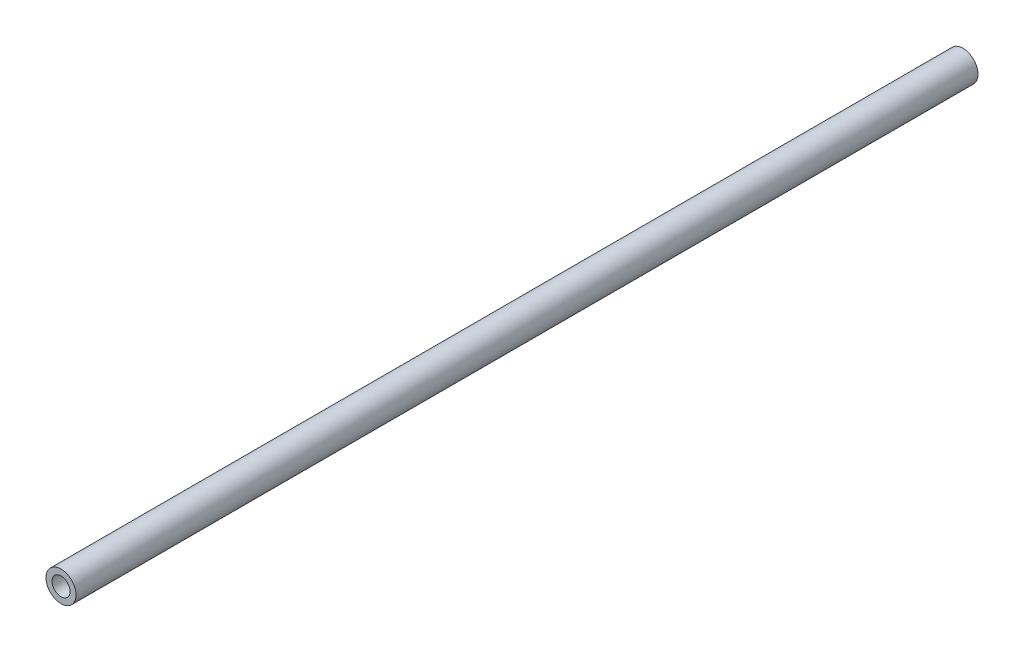
ISO-10303-21;
HEADER;
FILE_DESCRIPTION(('STEP AP214'),'2;1');
FILE_NAME('part.step','',(''),(''),'','','');
FILE_SCHEMA(('AUTOMOTIVE_DESIGN { 1 0 10303 214 1 1 1 1 }'));
ENDSEC;
DATA;
#1=APPLICATION_CONTEXT('core data for automotive mechanical design processes');
#2=APPLICATION_PROTOCOL_DEFINITION('international standard','automotive_design',2000,#1);
#3=PRODUCT_CONTEXT('',#1,'mechanical');
#4=PRODUCT('Part','Part','',(#3));
#5=PRODUCT_RELATED_PRODUCT_CATEGORY('part','',(#4));
#6=PRODUCT_DEFINITION_FORMATION('','',#4);
#7=PRODUCT_DEFINITION_CONTEXT('part definition',#1,'design');
#8=PRODUCT_DEFINITION('design','',#6,#7);
#9=PRODUCT_DEFINITION_SHAPE('','',#8);
#10=(LENGTH_UNIT() NAMED_UNIT(*) SI_UNIT(.MILLI.,.METRE.));
#11=(NAMED_UNIT(*) PLANE_ANGLE_UNIT() SI_UNIT($,.RADIAN.));
#12=(NAMED_UNIT(*) SI_UNIT($,.STERADIAN.) SOLID_ANGLE_UNIT());
#13=UNCERTAINTY_MEASURE_WITH_UNIT(LENGTH_MEASURE(1.E-05),#10,'distance_accuracy_value','');
#14=(GEOMETRIC_REPRESENTATION_CONTEXT(3) GLOBAL_UNCERTAINTY_ASSIGNED_CONTEXT((#13)) GLOBAL_UNIT_ASSIGNED_CONTEXT((#10,
#11,#12)) REPRESENTATION_CONTEXT('',''));
#15=CARTESIAN_POINT('',(0.,0.,0.));
#16=DIRECTION('',(0.,0.,1.));
#17=DIRECTION('',(1.,0.,0.));
#18=AXIS2_PLACEMENT_3D('',#15,#16,#17);
#19=CARTESIAN_POINT('',(0.,0.,150.));
#20=DIRECTION('',(0.,0.,1.));
#21=DIRECTION('',(1.,0.,0.));
#22=AXIS2_PLACEMENT_3D('',#19,#20,#21);
#23=PLANE('',#22);
#24=CARTESIAN_POINT('',(0.,0.,150.));
#25=DIRECTION('',(0.,0.,1.));
#26=DIRECTION('',(1.,0.,0.));
#27=AXIS2_PLACEMENT_3D('',#24,#25,#26);
#28=CIRCLE('',#27,2.5);
#29=CARTESIAN_POINT('',(2.5,0.,150.));
#30=VERTEX_POINT('',#29);
#31=EDGE_CURVE('E10',#30,#30,#28,.T.);
#32=ORIENTED_EDGE('',*,*,#31,.T.);
#33=EDGE_LOOP('',(#32));
#34=FACE_BOUND('',#33,.T.);
#35=CARTESIAN_POINT('',(0.,0.,150.));
#36=DIRECTION('',(0.,0.,1.));
#37=DIRECTION('',(1.,0.,0.));
#38=AXIS2_PLACEMENT_3D('',#35,#36,#37);
#39=CIRCLE('',#38,1.5);
#40=CARTESIAN_POINT('',(1.5,0.,150.));
#41=VERTEX_POINT('',#40);
#42=EDGE_CURVE('E41',#41,#41,#39,.T.);
#43=ORIENTED_EDGE('',*,*,#42,.F.);
#44=EDGE_LOOP('',(#43));
#45=FACE_BOUND('',#44,.T.);
#46=ADVANCED_FACE('F30',(#34,#45),#23,.T.);
#47=CARTESIAN_POINT('',(0.,0.,0.));
#48=DIRECTION('',(0.,0.,1.));
#49=DIRECTION('',(1.,0.,0.));
#50=AXIS2_PLACEMENT_3D('',#47,#48,#49);
#51=PLANE('',#50);
#52=CARTESIAN_POINT('',(0.,0.,0.));
#53=DIRECTION('',(0.,0.,1.));
#54=DIRECTION('',(1.,0.,0.));
#55=AXIS2_PLACEMENT_3D('',#52,#53,#54);
#56=CIRCLE('',#55,2.5);
#57=CARTESIAN_POINT('',(2.5,0.,0.));
#58=VERTEX_POINT('',#57);
#59=EDGE_CURVE('E34',#58,#58,#56,.T.);
#60=ORIENTED_EDGE('',*,*,#59,.F.);
#61=EDGE_LOOP('',(#60));
#62=FACE_BOUND('',#61,.T.);
#63=CARTESIAN_POINT('',(0.,0.,0.));
#64=DIRECTION('',(0.,0.,1.));
#65=DIRECTION('',(1.,0.,0.));
#66=AXIS2_PLACEMENT_3D('',#63,#64,#65);
#67=CIRCLE('',#66,1.5);
#68=CARTESIAN_POINT('',(1.5,0.,0.));
#69=VERTEX_POINT('',#68);
#70=EDGE_CURVE('E43',#69,#69,#67,.T.);
#71=ORIENTED_EDGE('',*,*,#70,.T.);
#72=EDGE_LOOP('',(#71));
#73=FACE_BOUND('',#72,.T.);
#74=ADVANCED_FACE('F53',(#62,#73),#51,.F.);
#75=CARTESIAN_POINT('',(0.,0.,150.));
#76=DIRECTION('',(0.,0.,-1.));
#77=DIRECTION('',(-1.,0.,0.));
#78=AXIS2_PLACEMENT_3D('',#75,#76,#77);
#79=CYLINDRICAL_SURFACE('',#78,2.5);
#80=ORIENTED_EDGE('',*,*,#31,.F.);
#81=EDGE_LOOP('',(#80));
#82=FACE_BOUND('',#81,.T.);
#83=ORIENTED_EDGE('',*,*,#59,.T.);
#84=EDGE_LOOP('',(#83));
#85=FACE_BOUND('',#84,.T.);
#86=ADVANCED_FACE('F32',(#82,#85),#79,.T.);
#87=CARTESIAN_POINT('',(0.,0.,150.));
#88=DIRECTION('',(0.,0.,-1.));
#89=DIRECTION('',(-1.,0.,0.));
#90=AXIS2_PLACEMENT_3D('',#87,#88,#89);
#91=CYLINDRICAL_SURFACE('',#90,1.5);
#92=ORIENTED_EDGE('',*,*,#42,.T.);
#93=EDGE_LOOP('',(#92));
#94=FACE_BOUND('',#93,.T.);
#95=ORIENTED_EDGE('',*,*,#70,.F.);
#96=EDGE_LOOP('',(#95));
#97=FACE_BOUND('',#96,.T.);
#98=ADVANCED_FACE('F49',(#94,#97),#91,.F.);
#99=CLOSED_SHELL('',(#46,#74,#86,#98));
#100=MANIFOLD_SOLID_BREP('B2',#99);
#101=ADVANCED_BREP_SHAPE_REPRESENTATION('',(#18,#100),#14);
#102=SHAPE_DEFINITION_REPRESENTATION(#9,#101);
ENDSEC;
END-ISO-10303-21;
